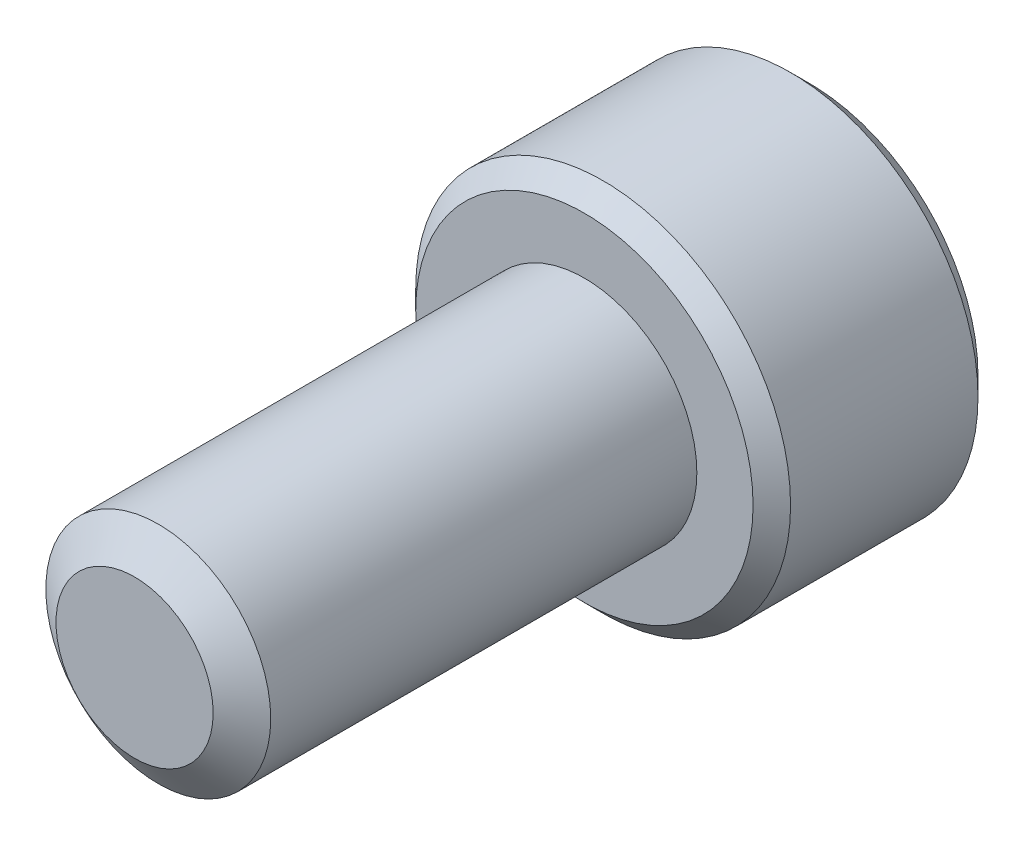
ISO-10303-21;
HEADER;
FILE_DESCRIPTION(('STEP AP214'),'2;1');
FILE_NAME('part.step','',(''),(''),'','','');
FILE_SCHEMA(('AUTOMOTIVE_DESIGN { 1 0 10303 214 1 1 1 1 }'));
ENDSEC;
DATA;
#1=APPLICATION_CONTEXT('core data for automotive mechanical design processes');
#2=APPLICATION_PROTOCOL_DEFINITION('international standard','automotive_design',2000,#1);
#3=PRODUCT_CONTEXT('',#1,'mechanical');
#4=PRODUCT('Part','Part','',(#3));
#5=PRODUCT_RELATED_PRODUCT_CATEGORY('part','',(#4));
#6=PRODUCT_DEFINITION_FORMATION('','',#4);
#7=PRODUCT_DEFINITION_CONTEXT('part definition',#1,'design');
#8=PRODUCT_DEFINITION('design','',#6,#7);
#9=PRODUCT_DEFINITION_SHAPE('','',#8);
#10=(LENGTH_UNIT() NAMED_UNIT(*) SI_UNIT(.MILLI.,.METRE.));
#11=(NAMED_UNIT(*) PLANE_ANGLE_UNIT() SI_UNIT($,.RADIAN.));
#12=(NAMED_UNIT(*) SI_UNIT($,.STERADIAN.) SOLID_ANGLE_UNIT());
#13=UNCERTAINTY_MEASURE_WITH_UNIT(LENGTH_MEASURE(1.E-05),#10,'distance_accuracy_value','');
#14=(GEOMETRIC_REPRESENTATION_CONTEXT(3) GLOBAL_UNCERTAINTY_ASSIGNED_CONTEXT((#13)) GLOBAL_UNIT_ASSIGNED_CONTEXT((#10,
#11,#12)) REPRESENTATION_CONTEXT('',''));
#15=CARTESIAN_POINT('',(0.,0.,0.));
#16=DIRECTION('',(0.,0.,1.));
#17=DIRECTION('',(1.,0.,0.));
#18=AXIS2_PLACEMENT_3D('',#15,#16,#17);
#19=CARTESIAN_POINT('',(0.,0.,-12.));
#20=DIRECTION('',(0.,0.,1.));
#21=DIRECTION('',(1.,0.,0.));
#22=AXIS2_PLACEMENT_3D('',#19,#20,#21);
#23=CYLINDRICAL_SURFACE('',#22,3.);
#24=CARTESIAN_POINT('',(0.,0.,-12.));
#25=DIRECTION('',(0.,0.,-1.));
#26=DIRECTION('',(-1.,0.,0.));
#27=AXIS2_PLACEMENT_3D('',#24,#25,#26);
#28=CIRCLE('',#27,3.);
#29=CARTESIAN_POINT('',(-3.,0.,-12.));
#30=VERTEX_POINT('',#29);
#31=EDGE_CURVE('E154',#30,#30,#28,.F.);
#32=ORIENTED_EDGE('',*,*,#31,.T.);
#33=EDGE_LOOP('',(#32));
#34=FACE_BOUND('',#33,.T.);
#35=CARTESIAN_POINT('',(0.,0.,-0.632650851713494));
#36=DIRECTION('',(0.,0.,1.));
#37=DIRECTION('',(1.,0.,0.));
#38=AXIS2_PLACEMENT_3D('',#35,#36,#37);
#39=CIRCLE('',#38,3.);
#40=CARTESIAN_POINT('',(3.,0.,-0.632650851713494));
#41=VERTEX_POINT('',#40);
#42=EDGE_CURVE('E171',#41,#41,#39,.T.);
#43=ORIENTED_EDGE('',*,*,#42,.F.);
#44=EDGE_LOOP('',(#43));
#45=FACE_BOUND('',#44,.T.);
#46=ADVANCED_FACE('F39',(#34,#45),#23,.T.);
#47=CARTESIAN_POINT('',(0.,0.,0.));
#48=DIRECTION('',(0.,0.,-1.));
#49=DIRECTION('',(-1.,0.,0.));
#50=AXIS2_PLACEMENT_3D('',#47,#48,#49);
#51=CONICAL_SURFACE('',#50,2.09648094716167,0.959931088596884);
#52=ORIENTED_EDGE('',*,*,#42,.T.);
#53=EDGE_LOOP('',(#52));
#54=FACE_BOUND('',#53,.T.);
#55=CARTESIAN_POINT('',(0.,0.,0.));
#56=DIRECTION('',(0.,0.,1.));
#57=DIRECTION('',(1.,0.,0.));
#58=AXIS2_PLACEMENT_3D('',#55,#56,#57);
#59=CIRCLE('',#58,2.09648094716167);
#60=CARTESIAN_POINT('',(2.09648094716167,0.,0.));
#61=VERTEX_POINT('',#60);
#62=EDGE_CURVE('E167',#61,#61,#59,.T.);
#63=ORIENTED_EDGE('',*,*,#62,.F.);
#64=EDGE_LOOP('',(#63));
#65=FACE_BOUND('',#64,.T.);
#66=ADVANCED_FACE('F220',(#54,#65),#51,.T.);
#67=CARTESIAN_POINT('',(0.,0.,0.));
#68=DIRECTION('',(0.,0.,1.));
#69=DIRECTION('',(1.,0.,0.));
#70=AXIS2_PLACEMENT_3D('',#67,#68,#69);
#71=PLANE('',#70);
#72=ORIENTED_EDGE('',*,*,#62,.T.);
#73=EDGE_LOOP('',(#72));
#74=FACE_BOUND('',#73,.T.);
#75=ADVANCED_FACE('F226',(#74),#71,.T.);
#76=CARTESIAN_POINT('',(0.,0.,-18.));
#77=DIRECTION('',(0.,0.,1.));
#78=DIRECTION('',(1.,0.,0.));
#79=AXIS2_PLACEMENT_3D('',#76,#77,#78);
#80=CYLINDRICAL_SURFACE('',#79,5.);
#81=CARTESIAN_POINT('',(0.,0.,-17.5));
#82=DIRECTION('',(0.,0.,-1.));
#83=DIRECTION('',(-1.,0.,0.));
#84=AXIS2_PLACEMENT_3D('',#81,#82,#83);
#85=CIRCLE('',#84,5.);
#86=CARTESIAN_POINT('',(-5.,0.,-17.5));
#87=VERTEX_POINT('',#86);
#88=EDGE_CURVE('E48',#87,#87,#85,.F.);
#89=ORIENTED_EDGE('',*,*,#88,.T.);
#90=EDGE_LOOP('',(#89));
#91=FACE_BOUND('',#90,.T.);
#92=CARTESIAN_POINT('',(0.,0.,-12.5));
#93=DIRECTION('',(0.,0.,-1.));
#94=DIRECTION('',(-1.,0.,0.));
#95=AXIS2_PLACEMENT_3D('',#92,#93,#94);
#96=CIRCLE('',#95,5.);
#97=CARTESIAN_POINT('',(-5.,0.,-12.5));
#98=VERTEX_POINT('',#97);
#99=EDGE_CURVE('E179',#98,#98,#96,.T.);
#100=ORIENTED_EDGE('',*,*,#99,.T.);
#101=EDGE_LOOP('',(#100));
#102=FACE_BOUND('',#101,.T.);
#103=ADVANCED_FACE('F186',(#91,#102),#80,.T.);
#104=CARTESIAN_POINT('',(0.,0.,-18.));
#105=DIRECTION('',(0.,0.,-1.));
#106=DIRECTION('',(-1.,0.,0.));
#107=AXIS2_PLACEMENT_3D('',#104,#105,#106);
#108=PLANE('',#107);
#109=CARTESIAN_POINT('',(0.,0.,-18.));
#110=DIRECTION('',(0.,0.,-1.));
#111=DIRECTION('',(-1.,0.,0.));
#112=AXIS2_PLACEMENT_3D('',#109,#110,#111);
#113=CIRCLE('',#112,4.5);
#114=CARTESIAN_POINT('',(-4.5,0.,-18.));
#115=VERTEX_POINT('',#114);
#116=EDGE_CURVE('E175',#115,#115,#113,.T.);
#117=ORIENTED_EDGE('',*,*,#116,.T.);
#118=EDGE_LOOP('',(#117));
#119=FACE_BOUND('',#118,.T.);
#120=DIRECTION('',(0.866025403784439,0.5,0.));
#121=VECTOR('',#120,1.);
#122=CARTESIAN_POINT('',(-2.5,1.44337567297406,-18.));
#123=LINE('',#122,#121);
#124=CARTESIAN_POINT('',(-2.5,1.44337567297406,-18.));
#125=VERTEX_POINT('',#124);
#126=CARTESIAN_POINT('',(0.,2.88675134594813,-18.));
#127=VERTEX_POINT('',#126);
#128=EDGE_CURVE('E55',#125,#127,#123,.T.);
#129=ORIENTED_EDGE('',*,*,#128,.F.);
#130=DIRECTION('',(0.,1.,0.));
#131=VECTOR('',#130,1.);
#132=CARTESIAN_POINT('',(-2.5,-1.44337567297406,-18.));
#133=LINE('',#132,#131);
#134=CARTESIAN_POINT('',(-2.5,-1.44337567297406,-18.));
#135=VERTEX_POINT('',#134);
#136=EDGE_CURVE('E148',#135,#125,#133,.T.);
#137=ORIENTED_EDGE('',*,*,#136,.F.);
#138=DIRECTION('',(-0.866025403784439,0.5,0.));
#139=VECTOR('',#138,1.);
#140=CARTESIAN_POINT('',(0.,-2.88675134594813,-18.));
#141=LINE('',#140,#139);
#142=CARTESIAN_POINT('',(0.,-2.88675134594813,-18.));
#143=VERTEX_POINT('',#142);
#144=EDGE_CURVE('E145',#143,#135,#141,.T.);
#145=ORIENTED_EDGE('',*,*,#144,.F.);
#146=DIRECTION('',(-0.866025403784439,-0.5,0.));
#147=VECTOR('',#146,1.);
#148=CARTESIAN_POINT('',(2.5,-1.44337567297407,-18.));
#149=LINE('',#148,#147);
#150=CARTESIAN_POINT('',(2.5,-1.44337567297407,-18.));
#151=VERTEX_POINT('',#150);
#152=EDGE_CURVE('E103',#151,#143,#149,.T.);
#153=ORIENTED_EDGE('',*,*,#152,.F.);
#154=DIRECTION('',(0.,-1.,0.));
#155=VECTOR('',#154,1.);
#156=CARTESIAN_POINT('',(2.5,1.44337567297406,-18.));
#157=LINE('',#156,#155);
#158=CARTESIAN_POINT('',(2.5,1.44337567297406,-18.));
#159=VERTEX_POINT('',#158);
#160=EDGE_CURVE('E139',#159,#151,#157,.T.);
#161=ORIENTED_EDGE('',*,*,#160,.F.);
#162=DIRECTION('',(0.866025403784439,-0.5,0.));
#163=VECTOR('',#162,1.);
#164=CARTESIAN_POINT('',(0.,2.88675134594813,-18.));
#165=LINE('',#164,#163);
#166=EDGE_CURVE('E135',#127,#159,#165,.T.);
#167=ORIENTED_EDGE('',*,*,#166,.F.);
#168=EDGE_LOOP('',(#129,#137,#145,#153,#161,#167));
#169=FACE_BOUND('',#168,.T.);
#170=ADVANCED_FACE('F194',(#119,#169),#108,.T.);
#171=CARTESIAN_POINT('',(0.,0.,-12.));
#172=DIRECTION('',(0.,0.,-1.));
#173=DIRECTION('',(-1.,0.,0.));
#174=AXIS2_PLACEMENT_3D('',#171,#172,#173);
#175=PLANE('',#174);
#176=CARTESIAN_POINT('',(0.,0.,-12.));
#177=DIRECTION('',(0.,0.,-1.));
#178=DIRECTION('',(-1.,0.,0.));
#179=AXIS2_PLACEMENT_3D('',#176,#177,#178);
#180=CIRCLE('',#179,4.49999999999999);
#181=CARTESIAN_POINT('',(-4.49999999999999,0.,-12.));
#182=VERTEX_POINT('',#181);
#183=EDGE_CURVE('E11',#182,#182,#180,.F.);
#184=ORIENTED_EDGE('',*,*,#183,.T.);
#185=EDGE_LOOP('',(#184));
#186=FACE_BOUND('',#185,.T.);
#187=ORIENTED_EDGE('',*,*,#31,.F.);
#188=EDGE_LOOP('',(#187));
#189=FACE_BOUND('',#188,.T.);
#190=ADVANCED_FACE('F197',(#186,#189),#175,.F.);
#191=CARTESIAN_POINT('',(-2.5,1.44337567297406,-14.25));
#192=DIRECTION('',(-0.5,0.866025403784439,0.));
#193=DIRECTION('',(-0.866025403784439,-0.5,0.));
#194=AXIS2_PLACEMENT_3D('',#191,#192,#193);
#195=PLANE('',#194);
#196=ORIENTED_EDGE('',*,*,#128,.T.);
#197=DIRECTION('',(0.,0.,-1.));
#198=VECTOR('',#197,1.);
#199=CARTESIAN_POINT('',(0.,2.88675134594813,-14.25));
#200=LINE('',#199,#198);
#201=CARTESIAN_POINT('',(0.,2.88675134594813,-14.25));
#202=VERTEX_POINT('',#201);
#203=EDGE_CURVE('E85',#202,#127,#200,.T.);
#204=ORIENTED_EDGE('',*,*,#203,.F.);
#205=DIRECTION('',(0.866025403784439,0.5,0.));
#206=VECTOR('',#205,1.);
#207=CARTESIAN_POINT('',(-2.5,1.44337567297406,-14.25));
#208=LINE('',#207,#206);
#209=CARTESIAN_POINT('',(-2.5,1.44337567297406,-14.25));
#210=VERTEX_POINT('',#209);
#211=EDGE_CURVE('E151',#210,#202,#208,.T.);
#212=ORIENTED_EDGE('',*,*,#211,.F.);
#213=DIRECTION('',(0.,0.,-1.));
#214=VECTOR('',#213,1.);
#215=CARTESIAN_POINT('',(-2.5,1.44337567297406,-14.25));
#216=LINE('',#215,#214);
#217=EDGE_CURVE('E63',#210,#125,#216,.T.);
#218=ORIENTED_EDGE('',*,*,#217,.T.);
#219=EDGE_LOOP('',(#196,#204,#212,#218));
#220=FACE_BOUND('',#219,.T.);
#221=ADVANCED_FACE('F207',(#220),#195,.F.);
#222=CARTESIAN_POINT('',(-2.5,-1.44337567297406,-14.25));
#223=DIRECTION('',(-1.,0.,0.));
#224=DIRECTION('',(0.,-1.,0.));
#225=AXIS2_PLACEMENT_3D('',#222,#223,#224);
#226=PLANE('',#225);
#227=ORIENTED_EDGE('',*,*,#136,.T.);
#228=ORIENTED_EDGE('',*,*,#217,.F.);
#229=DIRECTION('',(0.,1.,0.));
#230=VECTOR('',#229,1.);
#231=CARTESIAN_POINT('',(-2.5,-1.44337567297406,-14.25));
#232=LINE('',#231,#230);
#233=CARTESIAN_POINT('',(-2.5,-1.44337567297406,-14.25));
#234=VERTEX_POINT('',#233);
#235=EDGE_CURVE('E117',#234,#210,#232,.T.);
#236=ORIENTED_EDGE('',*,*,#235,.F.);
#237=DIRECTION('',(0.,0.,-1.));
#238=VECTOR('',#237,1.);
#239=CARTESIAN_POINT('',(-2.5,-1.44337567297406,-14.25));
#240=LINE('',#239,#238);
#241=EDGE_CURVE('E108',#234,#135,#240,.T.);
#242=ORIENTED_EDGE('',*,*,#241,.T.);
#243=EDGE_LOOP('',(#227,#228,#236,#242));
#244=FACE_BOUND('',#243,.T.);
#245=ADVANCED_FACE('F209',(#244),#226,.F.);
#246=CARTESIAN_POINT('',(0.,-2.88675134594813,-14.25));
#247=DIRECTION('',(-0.5,-0.866025403784439,0.));
#248=DIRECTION('',(0.866025403784439,-0.5,0.));
#249=AXIS2_PLACEMENT_3D('',#246,#247,#248);
#250=PLANE('',#249);
#251=ORIENTED_EDGE('',*,*,#144,.T.);
#252=ORIENTED_EDGE('',*,*,#241,.F.);
#253=DIRECTION('',(-0.866025403784439,0.5,0.));
#254=VECTOR('',#253,1.);
#255=CARTESIAN_POINT('',(0.,-2.88675134594813,-14.25));
#256=LINE('',#255,#254);
#257=CARTESIAN_POINT('',(0.,-2.88675134594813,-14.25));
#258=VERTEX_POINT('',#257);
#259=EDGE_CURVE('E112',#258,#234,#256,.T.);
#260=ORIENTED_EDGE('',*,*,#259,.F.);
#261=DIRECTION('',(0.,0.,-1.));
#262=VECTOR('',#261,1.);
#263=CARTESIAN_POINT('',(0.,-2.88675134594813,-14.25));
#264=LINE('',#263,#262);
#265=EDGE_CURVE('E96',#258,#143,#264,.T.);
#266=ORIENTED_EDGE('',*,*,#265,.T.);
#267=EDGE_LOOP('',(#251,#252,#260,#266));
#268=FACE_BOUND('',#267,.T.);
#269=ADVANCED_FACE('F113',(#268),#250,.F.);
#270=CARTESIAN_POINT('',(2.5,-1.44337567297407,-14.25));
#271=DIRECTION('',(0.5,-0.866025403784439,0.));
#272=DIRECTION('',(0.866025403784439,0.5,0.));
#273=AXIS2_PLACEMENT_3D('',#270,#271,#272);
#274=PLANE('',#273);
#275=ORIENTED_EDGE('',*,*,#152,.T.);
#276=ORIENTED_EDGE('',*,*,#265,.F.);
#277=DIRECTION('',(-0.866025403784439,-0.5,0.));
#278=VECTOR('',#277,1.);
#279=CARTESIAN_POINT('',(2.5,-1.44337567297407,-14.25));
#280=LINE('',#279,#278);
#281=CARTESIAN_POINT('',(2.5,-1.44337567297407,-14.25));
#282=VERTEX_POINT('',#281);
#283=EDGE_CURVE('E100',#282,#258,#280,.T.);
#284=ORIENTED_EDGE('',*,*,#283,.F.);
#285=DIRECTION('',(0.,0.,-1.));
#286=VECTOR('',#285,1.);
#287=CARTESIAN_POINT('',(2.5,-1.44337567297407,-14.25));
#288=LINE('',#287,#286);
#289=EDGE_CURVE('E109',#282,#151,#288,.T.);
#290=ORIENTED_EDGE('',*,*,#289,.T.);
#291=EDGE_LOOP('',(#275,#276,#284,#290));
#292=FACE_BOUND('',#291,.T.);
#293=ADVANCED_FACE('F98',(#292),#274,.F.);
#294=CARTESIAN_POINT('',(2.5,1.44337567297406,-14.25));
#295=DIRECTION('',(1.,0.,0.));
#296=DIRECTION('',(0.,0.,-1.));
#297=AXIS2_PLACEMENT_3D('',#294,#295,#296);
#298=PLANE('',#297);
#299=ORIENTED_EDGE('',*,*,#160,.T.);
#300=ORIENTED_EDGE('',*,*,#289,.F.);
#301=DIRECTION('',(0.,-1.,0.));
#302=VECTOR('',#301,1.);
#303=CARTESIAN_POINT('',(2.5,1.44337567297406,-14.25));
#304=LINE('',#303,#302);
#305=CARTESIAN_POINT('',(2.5,1.44337567297406,-14.25));
#306=VERTEX_POINT('',#305);
#307=EDGE_CURVE('E123',#306,#282,#304,.T.);
#308=ORIENTED_EDGE('',*,*,#307,.F.);
#309=DIRECTION('',(0.,0.,-1.));
#310=VECTOR('',#309,1.);
#311=CARTESIAN_POINT('',(2.5,1.44337567297406,-14.25));
#312=LINE('',#311,#310);
#313=EDGE_CURVE('E159',#306,#159,#312,.T.);
#314=ORIENTED_EDGE('',*,*,#313,.T.);
#315=EDGE_LOOP('',(#299,#300,#308,#314));
#316=FACE_BOUND('',#315,.T.);
#317=ADVANCED_FACE('F281',(#316),#298,.F.);
#318=CARTESIAN_POINT('',(0.,2.88675134594813,-14.25));
#319=DIRECTION('',(0.5,0.866025403784439,0.));
#320=DIRECTION('',(-0.866025403784439,0.5,0.));
#321=AXIS2_PLACEMENT_3D('',#318,#319,#320);
#322=PLANE('',#321);
#323=ORIENTED_EDGE('',*,*,#166,.T.);
#324=ORIENTED_EDGE('',*,*,#313,.F.);
#325=DIRECTION('',(0.866025403784439,-0.5,0.));
#326=VECTOR('',#325,1.);
#327=CARTESIAN_POINT('',(0.,2.88675134594813,-14.25));
#328=LINE('',#327,#326);
#329=EDGE_CURVE('E127',#202,#306,#328,.T.);
#330=ORIENTED_EDGE('',*,*,#329,.F.);
#331=ORIENTED_EDGE('',*,*,#203,.T.);
#332=EDGE_LOOP('',(#323,#324,#330,#331));
#333=FACE_BOUND('',#332,.T.);
#334=ADVANCED_FACE('F203',(#333),#322,.F.);
#335=CARTESIAN_POINT('',(2.5,4.33012701892219,-14.25));
#336=DIRECTION('',(0.,0.,-1.));
#337=DIRECTION('',(-1.,0.,0.));
#338=AXIS2_PLACEMENT_3D('',#335,#336,#337);
#339=PLANE('',#338);
#340=ORIENTED_EDGE('',*,*,#211,.T.);
#341=ORIENTED_EDGE('',*,*,#329,.T.);
#342=ORIENTED_EDGE('',*,*,#307,.T.);
#343=ORIENTED_EDGE('',*,*,#283,.T.);
#344=ORIENTED_EDGE('',*,*,#259,.T.);
#345=ORIENTED_EDGE('',*,*,#235,.T.);
#346=EDGE_LOOP('',(#340,#341,#342,#343,#344,#345));
#347=FACE_BOUND('',#346,.T.);
#348=ADVANCED_FACE('F120',(#347),#339,.T.);
#349=CARTESIAN_POINT('',(0.,0.,-18.));
#350=DIRECTION('',(0.,0.,1.));
#351=DIRECTION('',(1.,0.,0.));
#352=AXIS2_PLACEMENT_3D('',#349,#350,#351);
#353=CONICAL_SURFACE('',#352,4.5,0.785398163397444);
#354=ORIENTED_EDGE('',*,*,#88,.F.);
#355=EDGE_LOOP('',(#354));
#356=FACE_BOUND('',#355,.T.);
#357=ORIENTED_EDGE('',*,*,#116,.F.);
#358=EDGE_LOOP('',(#357));
#359=FACE_BOUND('',#358,.T.);
#360=ADVANCED_FACE('F189',(#356,#359),#353,.T.);
#361=CARTESIAN_POINT('',(0.,0.,-12.5));
#362=DIRECTION('',(0.,0.,-1.));
#363=DIRECTION('',(-1.,0.,0.));
#364=AXIS2_PLACEMENT_3D('',#361,#362,#363);
#365=CONICAL_SURFACE('',#364,5.,0.785398163397451);
#366=ORIENTED_EDGE('',*,*,#183,.F.);
#367=EDGE_LOOP('',(#366));
#368=FACE_BOUND('',#367,.T.);
#369=ORIENTED_EDGE('',*,*,#99,.F.);
#370=EDGE_LOOP('',(#369));
#371=FACE_BOUND('',#370,.T.);
#372=ADVANCED_FACE('F41',(#368,#371),#365,.T.);
#373=CLOSED_SHELL('',(#46,#66,#75,#103,#170,#190,#221,#245,#269,#293,#317,#334,#348,#360,#372));
#374=MANIFOLD_SOLID_BREP('B2',#373);
#375=ADVANCED_BREP_SHAPE_REPRESENTATION('',(#18,#374),#14);
#376=SHAPE_DEFINITION_REPRESENTATION(#9,#375);
ENDSEC;
END-ISO-10303-21;
